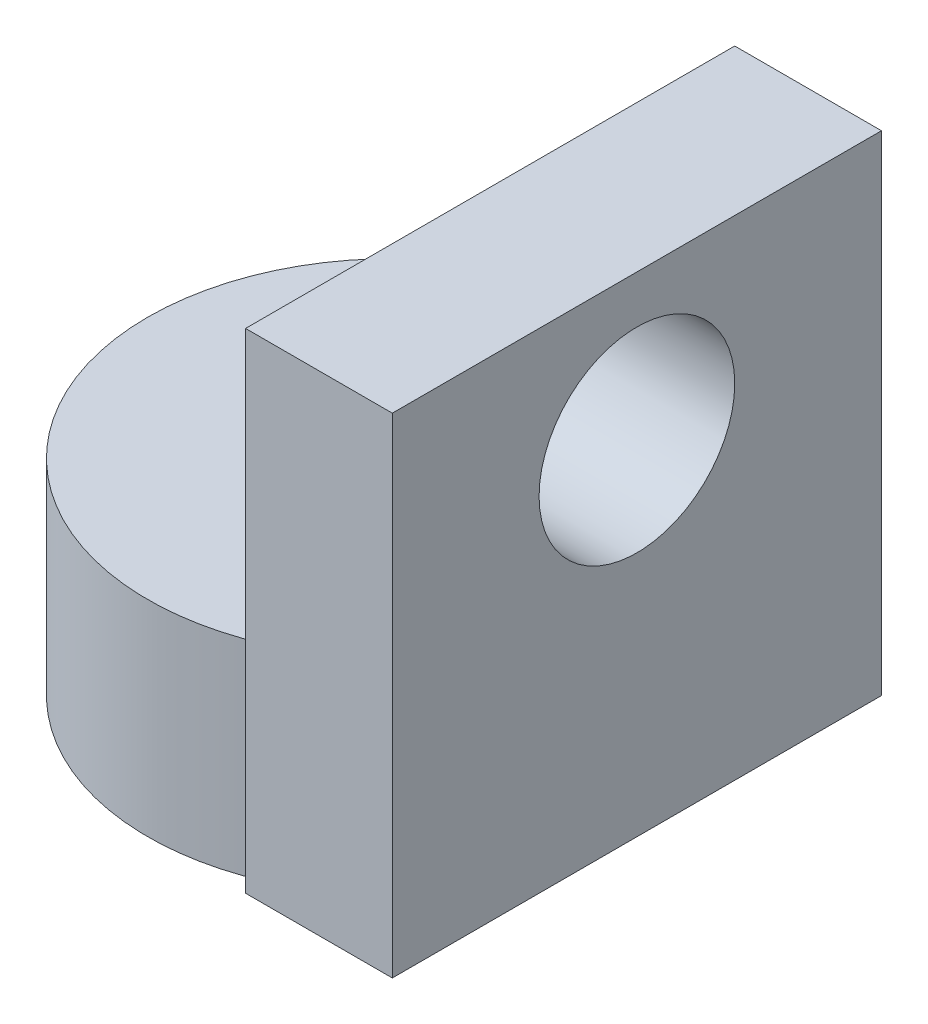
ISO-10303-21;
HEADER;
FILE_DESCRIPTION(('STEP AP214'),'2;1');
FILE_NAME('part.step','',(''),(''),'','','');
FILE_SCHEMA(('AUTOMOTIVE_DESIGN { 1 0 10303 214 1 1 1 1 }'));
ENDSEC;
DATA;
#1=APPLICATION_CONTEXT('core data for automotive mechanical design processes');
#2=APPLICATION_PROTOCOL_DEFINITION('international standard','automotive_design',2000,#1);
#3=PRODUCT_CONTEXT('',#1,'mechanical');
#4=PRODUCT('Part','Part','',(#3));
#5=PRODUCT_RELATED_PRODUCT_CATEGORY('part','',(#4));
#6=PRODUCT_DEFINITION_FORMATION('','',#4);
#7=PRODUCT_DEFINITION_CONTEXT('part definition',#1,'design');
#8=PRODUCT_DEFINITION('design','',#6,#7);
#9=PRODUCT_DEFINITION_SHAPE('','',#8);
#10=(LENGTH_UNIT() NAMED_UNIT(*) SI_UNIT(.MILLI.,.METRE.));
#11=(NAMED_UNIT(*) PLANE_ANGLE_UNIT() SI_UNIT($,.RADIAN.));
#12=(NAMED_UNIT(*) SI_UNIT($,.STERADIAN.) SOLID_ANGLE_UNIT());
#13=UNCERTAINTY_MEASURE_WITH_UNIT(LENGTH_MEASURE(1.E-05),#10,'distance_accuracy_value','');
#14=(GEOMETRIC_REPRESENTATION_CONTEXT(3) GLOBAL_UNCERTAINTY_ASSIGNED_CONTEXT((#13)) GLOBAL_UNIT_ASSIGNED_CONTEXT((#10,
#11,#12)) REPRESENTATION_CONTEXT('',''));
#15=CARTESIAN_POINT('',(0.,0.,0.));
#16=DIRECTION('',(0.,0.,1.));
#17=DIRECTION('',(1.,0.,0.));
#18=AXIS2_PLACEMENT_3D('',#15,#16,#17);
#19=CARTESIAN_POINT('',(0.,2.1,0.));
#20=DIRECTION('',(0.,1.,0.));
#21=DIRECTION('',(0.,0.,1.));
#22=AXIS2_PLACEMENT_3D('',#19,#20,#21);
#23=PLANE('',#22);
#24=DIRECTION('',(0.,0.,1.));
#25=VECTOR('',#24,1.);
#26=CARTESIAN_POINT('',(1.,2.1,0.));
#27=LINE('',#26,#25);
#28=CARTESIAN_POINT('',(1.,2.1,-2.29128784747792));
#29=VERTEX_POINT('',#28);
#30=CARTESIAN_POINT('',(1.,2.1,0.));
#31=VERTEX_POINT('',#30);
#32=EDGE_CURVE('E141',#29,#31,#27,.T.);
#33=ORIENTED_EDGE('',*,*,#32,.F.);
#34=CARTESIAN_POINT('',(0.,2.1,0.));
#35=DIRECTION('',(0.,1.,0.));
#36=DIRECTION('',(0.,0.,1.));
#37=AXIS2_PLACEMENT_3D('',#34,#35,#36);
#38=CIRCLE('',#37,2.5);
#39=CARTESIAN_POINT('',(1.,2.1,2.29128784747792));
#40=VERTEX_POINT('',#39);
#41=EDGE_CURVE('E11',#29,#40,#38,.T.);
#42=ORIENTED_EDGE('',*,*,#41,.T.);
#43=EDGE_CURVE('E52',#31,#40,#27,.T.);
#44=ORIENTED_EDGE('',*,*,#43,.F.);
#45=CARTESIAN_POINT('',(0.,2.1,0.));
#46=DIRECTION('',(0.,1.,0.));
#47=DIRECTION('',(0.,0.,1.));
#48=AXIS2_PLACEMENT_3D('',#45,#46,#47);
#49=CIRCLE('',#48,1.);
#50=EDGE_CURVE('E144',#31,#31,#49,.T.);
#51=ORIENTED_EDGE('',*,*,#50,.F.);
#52=EDGE_LOOP('',(#33,#42,#44,#51));
#53=FACE_BOUND('',#52,.T.);
#54=ADVANCED_FACE('F37',(#53),#23,.T.);
#55=CARTESIAN_POINT('',(0.,0.,0.));
#56=DIRECTION('',(0.,1.,0.));
#57=DIRECTION('',(0.,0.,1.));
#58=AXIS2_PLACEMENT_3D('',#55,#56,#57);
#59=PLANE('',#58);
#60=CARTESIAN_POINT('',(0.,0.,0.));
#61=DIRECTION('',(0.,1.,0.));
#62=DIRECTION('',(0.,0.,1.));
#63=AXIS2_PLACEMENT_3D('',#60,#61,#62);
#64=CIRCLE('',#63,1.);
#65=CARTESIAN_POINT('',(0.,0.,1.));
#66=VERTEX_POINT('',#65);
#67=EDGE_CURVE('E147',#66,#66,#64,.T.);
#68=ORIENTED_EDGE('',*,*,#67,.T.);
#69=EDGE_LOOP('',(#68));
#70=FACE_BOUND('',#69,.T.);
#71=CARTESIAN_POINT('',(0.,0.,0.));
#72=DIRECTION('',(0.,1.,0.));
#73=DIRECTION('',(0.,0.,1.));
#74=AXIS2_PLACEMENT_3D('',#71,#72,#73);
#75=CIRCLE('',#74,2.5);
#76=CARTESIAN_POINT('',(1.,0.,-2.29128784747792));
#77=VERTEX_POINT('',#76);
#78=CARTESIAN_POINT('',(1.,0.,2.29128784747792));
#79=VERTEX_POINT('',#78);
#80=EDGE_CURVE('E41',#77,#79,#75,.T.);
#81=ORIENTED_EDGE('',*,*,#80,.F.);
#82=DIRECTION('',(0.,0.,-1.));
#83=VECTOR('',#82,1.);
#84=CARTESIAN_POINT('',(1.,0.,2.5));
#85=LINE('',#84,#83);
#86=CARTESIAN_POINT('',(1.,0.,-2.5));
#87=VERTEX_POINT('',#86);
#88=EDGE_CURVE('E114',#77,#87,#85,.T.);
#89=ORIENTED_EDGE('',*,*,#88,.T.);
#90=DIRECTION('',(1.,0.,0.));
#91=VECTOR('',#90,1.);
#92=CARTESIAN_POINT('',(1.,0.,-2.5));
#93=LINE('',#92,#91);
#94=CARTESIAN_POINT('',(2.5,0.,-2.5));
#95=VERTEX_POINT('',#94);
#96=EDGE_CURVE('E104',#87,#95,#93,.T.);
#97=ORIENTED_EDGE('',*,*,#96,.T.);
#98=DIRECTION('',(0.,0.,-1.));
#99=VECTOR('',#98,1.);
#100=CARTESIAN_POINT('',(2.5,0.,2.5));
#101=LINE('',#100,#99);
#102=CARTESIAN_POINT('',(2.5,0.,2.5));
#103=VERTEX_POINT('',#102);
#104=EDGE_CURVE('E99',#103,#95,#101,.T.);
#105=ORIENTED_EDGE('',*,*,#104,.F.);
#106=DIRECTION('',(1.,0.,0.));
#107=VECTOR('',#106,1.);
#108=CARTESIAN_POINT('',(1.,0.,2.5));
#109=LINE('',#108,#107);
#110=CARTESIAN_POINT('',(1.,0.,2.5));
#111=VERTEX_POINT('',#110);
#112=EDGE_CURVE('E92',#111,#103,#109,.T.);
#113=ORIENTED_EDGE('',*,*,#112,.F.);
#114=EDGE_CURVE('E96',#111,#79,#85,.T.);
#115=ORIENTED_EDGE('',*,*,#114,.T.);
#116=EDGE_LOOP('',(#81,#89,#97,#105,#113,#115));
#117=FACE_BOUND('',#116,.T.);
#118=ADVANCED_FACE('F95',(#70,#117),#59,.F.);
#119=CARTESIAN_POINT('',(0.,2.1,0.));
#120=DIRECTION('',(0.,-1.,0.));
#121=DIRECTION('',(0.,0.,-1.));
#122=AXIS2_PLACEMENT_3D('',#119,#120,#121);
#123=CYLINDRICAL_SURFACE('',#122,2.5);
#124=ORIENTED_EDGE('',*,*,#41,.F.);
#125=DIRECTION('',(0.,-1.,0.));
#126=VECTOR('',#125,1.);
#127=CARTESIAN_POINT('',(1.,2.1,-2.29128784747792));
#128=LINE('',#127,#126);
#129=EDGE_CURVE('E58',#29,#77,#128,.T.);
#130=ORIENTED_EDGE('',*,*,#129,.T.);
#131=ORIENTED_EDGE('',*,*,#80,.T.);
#132=DIRECTION('',(0.,-1.,0.));
#133=VECTOR('',#132,1.);
#134=CARTESIAN_POINT('',(1.,2.1,2.29128784747792));
#135=LINE('',#134,#133);
#136=EDGE_CURVE('E112',#79,#40,#135,.F.);
#137=ORIENTED_EDGE('',*,*,#136,.T.);
#138=EDGE_LOOP('',(#124,#130,#131,#137));
#139=FACE_BOUND('',#138,.T.);
#140=ADVANCED_FACE('F39',(#139),#123,.T.);
#141=CARTESIAN_POINT('',(0.,2.1,0.));
#142=DIRECTION('',(0.,-1.,0.));
#143=DIRECTION('',(0.,0.,-1.));
#144=AXIS2_PLACEMENT_3D('',#141,#142,#143);
#145=CYLINDRICAL_SURFACE('',#144,1.);
#146=ORIENTED_EDGE('',*,*,#67,.F.);
#147=EDGE_LOOP('',(#146));
#148=FACE_BOUND('',#147,.T.);
#149=ORIENTED_EDGE('',*,*,#50,.T.);
#150=EDGE_LOOP('',(#149));
#151=FACE_BOUND('',#150,.T.);
#152=ADVANCED_FACE('F155',(#148,#151),#145,.F.);
#153=CARTESIAN_POINT('',(1.,0.,0.));
#154=DIRECTION('',(-1.,0.,0.));
#155=DIRECTION('',(0.,0.,1.));
#156=AXIS2_PLACEMENT_3D('',#153,#154,#155);
#157=PLANE('',#156);
#158=CARTESIAN_POINT('',(1.,3.51306793309467,0.));
#159=DIRECTION('',(1.,0.,0.));
#160=DIRECTION('',(0.,0.,-1.));
#161=AXIS2_PLACEMENT_3D('',#158,#159,#160);
#162=CIRCLE('',#161,1.);
#163=CARTESIAN_POINT('',(1.,3.51306793309467,-1.));
#164=VERTEX_POINT('',#163);
#165=EDGE_CURVE('E132',#164,#164,#162,.T.);
#166=ORIENTED_EDGE('',*,*,#165,.T.);
#167=EDGE_LOOP('',(#166));
#168=FACE_BOUND('',#167,.T.);
#169=ORIENTED_EDGE('',*,*,#129,.F.);
#170=ORIENTED_EDGE('',*,*,#32,.T.);
#171=ORIENTED_EDGE('',*,*,#43,.T.);
#172=ORIENTED_EDGE('',*,*,#136,.F.);
#173=ORIENTED_EDGE('',*,*,#114,.F.);
#174=DIRECTION('',(0.,-1.,0.));
#175=VECTOR('',#174,1.);
#176=CARTESIAN_POINT('',(1.,0.,2.5));
#177=LINE('',#176,#175);
#178=CARTESIAN_POINT('',(1.,5.,2.5));
#179=VERTEX_POINT('',#178);
#180=EDGE_CURVE('E110',#179,#111,#177,.T.);
#181=ORIENTED_EDGE('',*,*,#180,.F.);
#182=DIRECTION('',(0.,0.,1.));
#183=VECTOR('',#182,1.);
#184=CARTESIAN_POINT('',(1.,5.,2.5));
#185=LINE('',#184,#183);
#186=CARTESIAN_POINT('',(1.,5.,-2.5));
#187=VERTEX_POINT('',#186);
#188=EDGE_CURVE('E105',#187,#179,#185,.T.);
#189=ORIENTED_EDGE('',*,*,#188,.F.);
#190=DIRECTION('',(0.,1.,0.));
#191=VECTOR('',#190,1.);
#192=CARTESIAN_POINT('',(1.,0.,-2.5));
#193=LINE('',#192,#191);
#194=EDGE_CURVE('E113',#87,#187,#193,.T.);
#195=ORIENTED_EDGE('',*,*,#194,.F.);
#196=ORIENTED_EDGE('',*,*,#88,.F.);
#197=EDGE_LOOP('',(#169,#170,#171,#172,#173,#181,#189,#195,#196));
#198=FACE_BOUND('',#197,.T.);
#199=ADVANCED_FACE('F108',(#168,#198),#157,.T.);
#200=CARTESIAN_POINT('',(1.,0.,2.5));
#201=DIRECTION('',(0.,0.,1.));
#202=DIRECTION('',(1.,0.,0.));
#203=AXIS2_PLACEMENT_3D('',#200,#201,#202);
#204=PLANE('',#203);
#205=DIRECTION('',(0.,-1.,0.));
#206=VECTOR('',#205,1.);
#207=CARTESIAN_POINT('',(2.5,0.,2.5));
#208=LINE('',#207,#206);
#209=CARTESIAN_POINT('',(2.5,5.,2.5));
#210=VERTEX_POINT('',#209);
#211=EDGE_CURVE('E130',#210,#103,#208,.T.);
#212=ORIENTED_EDGE('',*,*,#211,.F.);
#213=DIRECTION('',(1.,0.,0.));
#214=VECTOR('',#213,1.);
#215=CARTESIAN_POINT('',(1.,5.,2.5));
#216=LINE('',#215,#214);
#217=EDGE_CURVE('E117',#179,#210,#216,.T.);
#218=ORIENTED_EDGE('',*,*,#217,.F.);
#219=ORIENTED_EDGE('',*,*,#180,.T.);
#220=ORIENTED_EDGE('',*,*,#112,.T.);
#221=EDGE_LOOP('',(#212,#218,#219,#220));
#222=FACE_BOUND('',#221,.T.);
#223=ADVANCED_FACE('F116',(#222),#204,.T.);
#224=CARTESIAN_POINT('',(1.,5.,2.5));
#225=DIRECTION('',(0.,1.,0.));
#226=DIRECTION('',(0.,0.,1.));
#227=AXIS2_PLACEMENT_3D('',#224,#225,#226);
#228=PLANE('',#227);
#229=DIRECTION('',(0.,0.,1.));
#230=VECTOR('',#229,1.);
#231=CARTESIAN_POINT('',(2.5,5.,2.5));
#232=LINE('',#231,#230);
#233=CARTESIAN_POINT('',(2.5,5.,-2.5));
#234=VERTEX_POINT('',#233);
#235=EDGE_CURVE('E118',#234,#210,#232,.T.);
#236=ORIENTED_EDGE('',*,*,#235,.F.);
#237=DIRECTION('',(1.,0.,0.));
#238=VECTOR('',#237,1.);
#239=CARTESIAN_POINT('',(1.,5.,-2.5));
#240=LINE('',#239,#238);
#241=EDGE_CURVE('E137',#187,#234,#240,.T.);
#242=ORIENTED_EDGE('',*,*,#241,.F.);
#243=ORIENTED_EDGE('',*,*,#188,.T.);
#244=ORIENTED_EDGE('',*,*,#217,.T.);
#245=EDGE_LOOP('',(#236,#242,#243,#244));
#246=FACE_BOUND('',#245,.T.);
#247=ADVANCED_FACE('F201',(#246),#228,.T.);
#248=CARTESIAN_POINT('',(1.,0.,-2.5));
#249=DIRECTION('',(0.,0.,-1.));
#250=DIRECTION('',(-1.,0.,0.));
#251=AXIS2_PLACEMENT_3D('',#248,#249,#250);
#252=PLANE('',#251);
#253=DIRECTION('',(0.,1.,0.));
#254=VECTOR('',#253,1.);
#255=CARTESIAN_POINT('',(2.5,0.,-2.5));
#256=LINE('',#255,#254);
#257=EDGE_CURVE('E121',#95,#234,#256,.T.);
#258=ORIENTED_EDGE('',*,*,#257,.F.);
#259=ORIENTED_EDGE('',*,*,#96,.F.);
#260=ORIENTED_EDGE('',*,*,#194,.T.);
#261=ORIENTED_EDGE('',*,*,#241,.T.);
#262=EDGE_LOOP('',(#258,#259,#260,#261));
#263=FACE_BOUND('',#262,.T.);
#264=ADVANCED_FACE('F210',(#263),#252,.T.);
#265=CARTESIAN_POINT('',(2.5,0.,0.));
#266=DIRECTION('',(-1.,0.,0.));
#267=DIRECTION('',(0.,0.,1.));
#268=AXIS2_PLACEMENT_3D('',#265,#266,#267);
#269=PLANE('',#268);
#270=ORIENTED_EDGE('',*,*,#104,.T.);
#271=ORIENTED_EDGE('',*,*,#257,.T.);
#272=ORIENTED_EDGE('',*,*,#235,.T.);
#273=ORIENTED_EDGE('',*,*,#211,.T.);
#274=EDGE_LOOP('',(#270,#271,#272,#273));
#275=FACE_BOUND('',#274,.T.);
#276=CARTESIAN_POINT('',(2.5,3.51306793309467,0.));
#277=DIRECTION('',(1.,0.,0.));
#278=DIRECTION('',(0.,0.,-1.));
#279=AXIS2_PLACEMENT_3D('',#276,#277,#278);
#280=CIRCLE('',#279,1.);
#281=CARTESIAN_POINT('',(2.5,3.51306793309467,-1.));
#282=VERTEX_POINT('',#281);
#283=EDGE_CURVE('E124',#282,#282,#280,.T.);
#284=ORIENTED_EDGE('',*,*,#283,.F.);
#285=EDGE_LOOP('',(#284));
#286=FACE_BOUND('',#285,.T.);
#287=ADVANCED_FACE('F221',(#275,#286),#269,.F.);
#288=CARTESIAN_POINT('',(1.,3.51306793309467,0.));
#289=DIRECTION('',(1.,0.,0.));
#290=DIRECTION('',(0.,0.,-1.));
#291=AXIS2_PLACEMENT_3D('',#288,#289,#290);
#292=CYLINDRICAL_SURFACE('',#291,1.);
#293=ORIENTED_EDGE('',*,*,#165,.F.);
#294=EDGE_LOOP('',(#293));
#295=FACE_BOUND('',#294,.T.);
#296=ORIENTED_EDGE('',*,*,#283,.T.);
#297=EDGE_LOOP('',(#296));
#298=FACE_BOUND('',#297,.T.);
#299=ADVANCED_FACE('F232',(#295,#298),#292,.F.);
#300=CLOSED_SHELL('',(#54,#118,#140,#152,#199,#223,#247,#264,#287,#299));
#301=MANIFOLD_SOLID_BREP('B2',#300);
#302=ADVANCED_BREP_SHAPE_REPRESENTATION('',(#18,#301),#14);
#303=SHAPE_DEFINITION_REPRESENTATION(#9,#302);
ENDSEC;
END-ISO-10303-21;
